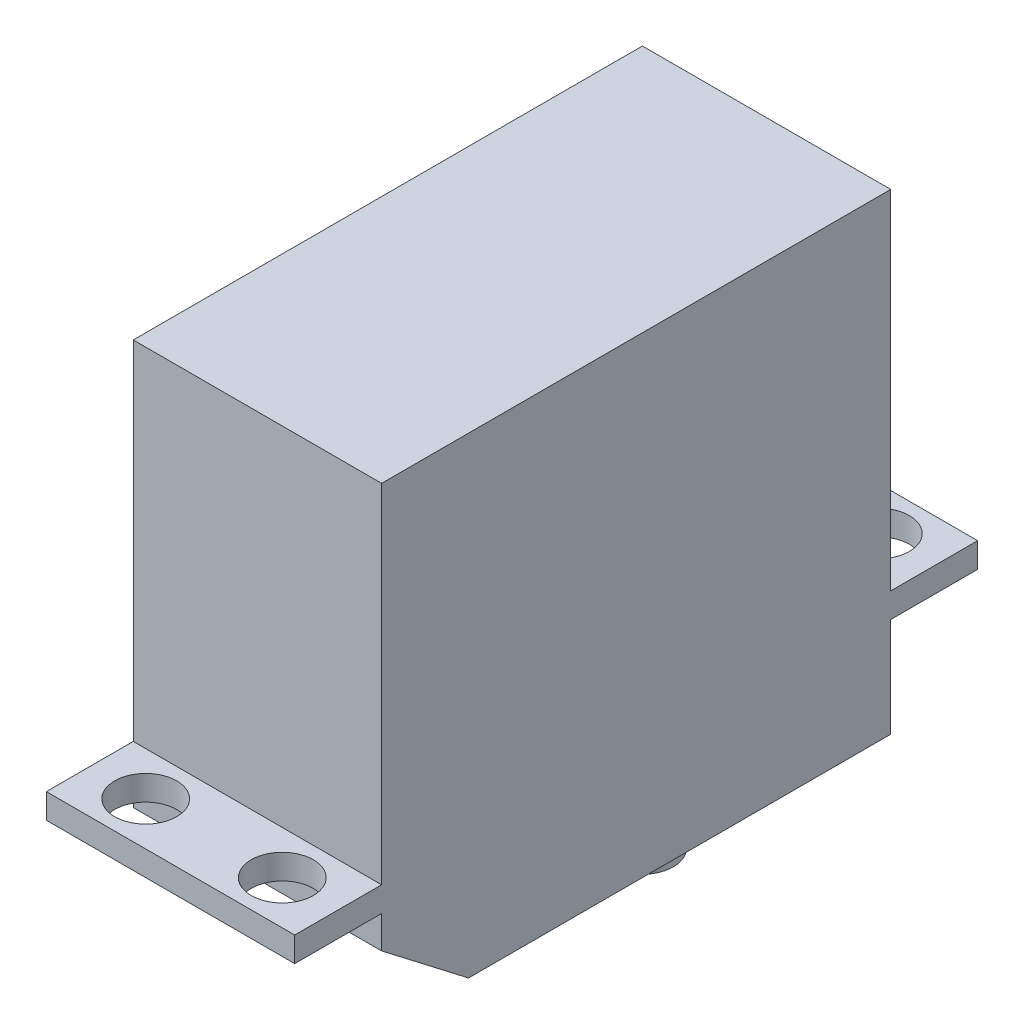
ISO-10303-21;
HEADER;
FILE_DESCRIPTION(('STEP AP214'),'2;1');
FILE_NAME('part.step','',(''),(''),'','','');
FILE_SCHEMA(('AUTOMOTIVE_DESIGN { 1 0 10303 214 1 1 1 1 }'));
ENDSEC;
DATA;
#1=APPLICATION_CONTEXT('core data for automotive mechanical design processes');
#2=APPLICATION_PROTOCOL_DEFINITION('international standard','automotive_design',2000,#1);
#3=PRODUCT_CONTEXT('',#1,'mechanical');
#4=PRODUCT('Part','Part','',(#3));
#5=PRODUCT_RELATED_PRODUCT_CATEGORY('part','',(#4));
#6=PRODUCT_DEFINITION_FORMATION('','',#4);
#7=PRODUCT_DEFINITION_CONTEXT('part definition',#1,'design');
#8=PRODUCT_DEFINITION('design','',#6,#7);
#9=PRODUCT_DEFINITION_SHAPE('','',#8);
#10=(LENGTH_UNIT() NAMED_UNIT(*) SI_UNIT(.MILLI.,.METRE.));
#11=(NAMED_UNIT(*) PLANE_ANGLE_UNIT() SI_UNIT($,.RADIAN.));
#12=(NAMED_UNIT(*) SI_UNIT($,.STERADIAN.) SOLID_ANGLE_UNIT());
#13=UNCERTAINTY_MEASURE_WITH_UNIT(LENGTH_MEASURE(1.E-05),#10,'distance_accuracy_value','');
#14=(GEOMETRIC_REPRESENTATION_CONTEXT(3) GLOBAL_UNCERTAINTY_ASSIGNED_CONTEXT((#13)) GLOBAL_UNIT_ASSIGNED_CONTEXT((#10,
#11,#12)) REPRESENTATION_CONTEXT('',''));
#15=CARTESIAN_POINT('',(0.,0.,0.));
#16=DIRECTION('',(0.,0.,1.));
#17=DIRECTION('',(1.,0.,0.));
#18=AXIS2_PLACEMENT_3D('',#15,#16,#17);
#19=CARTESIAN_POINT('',(20.,0.,-7.));
#20=DIRECTION('',(0.,1.,0.));
#21=DIRECTION('',(0.,0.,1.));
#22=AXIS2_PLACEMENT_3D('',#19,#20,#21);
#23=PLANE('',#22);
#24=DIRECTION('',(0.,0.,-1.));
#25=VECTOR('',#24,1.);
#26=CARTESIAN_POINT('',(0.,0.,-7.));
#27=LINE('',#26,#25);
#28=CARTESIAN_POINT('',(0.,0.,-7.));
#29=VERTEX_POINT('',#28);
#30=CARTESIAN_POINT('',(0.,0.,-41.));
#31=VERTEX_POINT('',#30);
#32=EDGE_CURVE('E185',#29,#31,#27,.T.);
#33=ORIENTED_EDGE('',*,*,#32,.T.);
#34=DIRECTION('',(-1.,0.,0.));
#35=VECTOR('',#34,1.);
#36=CARTESIAN_POINT('',(20.,0.,-41.));
#37=LINE('',#36,#35);
#38=CARTESIAN_POINT('',(20.,0.,-41.));
#39=VERTEX_POINT('',#38);
#40=EDGE_CURVE('E196',#39,#31,#37,.T.);
#41=ORIENTED_EDGE('',*,*,#40,.F.);
#42=DIRECTION('',(0.,0.,-1.));
#43=VECTOR('',#42,1.);
#44=CARTESIAN_POINT('',(20.,0.,-7.));
#45=LINE('',#44,#43);
#46=CARTESIAN_POINT('',(20.,0.,-7.));
#47=VERTEX_POINT('',#46);
#48=EDGE_CURVE('E261',#47,#39,#45,.T.);
#49=ORIENTED_EDGE('',*,*,#48,.F.);
#50=DIRECTION('',(-1.,0.,0.));
#51=VECTOR('',#50,1.);
#52=CARTESIAN_POINT('',(20.,0.,-7.));
#53=LINE('',#52,#51);
#54=EDGE_CURVE('E199',#47,#29,#53,.T.);
#55=ORIENTED_EDGE('',*,*,#54,.T.);
#56=EDGE_LOOP('',(#33,#41,#49,#55));
#57=FACE_BOUND('',#56,.T.);
#58=CARTESIAN_POINT('',(10.,0.,-31.));
#59=DIRECTION('',(0.,1.,0.));
#60=DIRECTION('',(0.,0.,1.));
#61=AXIS2_PLACEMENT_3D('',#58,#59,#60);
#62=CIRCLE('',#61,2.5);
#63=CARTESIAN_POINT('',(10.,0.,-28.5));
#64=VERTEX_POINT('',#63);
#65=EDGE_CURVE('E11',#64,#64,#62,.F.);
#66=ORIENTED_EDGE('',*,*,#65,.F.);
#67=EDGE_LOOP('',(#66));
#68=FACE_BOUND('',#67,.T.);
#69=ADVANCED_FACE('F37',(#57,#68),#23,.F.);
#70=CARTESIAN_POINT('',(20.,10.,-41.));
#71=DIRECTION('',(0.,0.,1.));
#72=DIRECTION('',(0.,-1.,0.));
#73=AXIS2_PLACEMENT_3D('',#70,#71,#72);
#74=PLANE('',#73);
#75=DIRECTION('',(0.,1.,0.));
#76=VECTOR('',#75,1.);
#77=CARTESIAN_POINT('',(0.,10.,-41.));
#78=LINE('',#77,#76);
#79=CARTESIAN_POINT('',(0.,10.,-41.));
#80=VERTEX_POINT('',#79);
#81=CARTESIAN_POINT('',(0.,38.,-41.));
#82=VERTEX_POINT('',#81);
#83=EDGE_CURVE('E167',#80,#82,#78,.T.);
#84=ORIENTED_EDGE('',*,*,#83,.T.);
#85=DIRECTION('',(-1.,0.,0.));
#86=VECTOR('',#85,1.);
#87=CARTESIAN_POINT('',(20.,38.,-41.));
#88=LINE('',#87,#86);
#89=CARTESIAN_POINT('',(20.,38.,-41.));
#90=VERTEX_POINT('',#89);
#91=EDGE_CURVE('E47',#90,#82,#88,.T.);
#92=ORIENTED_EDGE('',*,*,#91,.F.);
#93=DIRECTION('',(0.,1.,0.));
#94=VECTOR('',#93,1.);
#95=CARTESIAN_POINT('',(20.,10.,-41.));
#96=LINE('',#95,#94);
#97=CARTESIAN_POINT('',(20.,10.,-41.));
#98=VERTEX_POINT('',#97);
#99=EDGE_CURVE('E192',#98,#90,#96,.T.);
#100=ORIENTED_EDGE('',*,*,#99,.F.);
#101=DIRECTION('',(-1.,0.,0.));
#102=VECTOR('',#101,1.);
#103=CARTESIAN_POINT('',(20.,10.,-41.));
#104=LINE('',#103,#102);
#105=EDGE_CURVE('E163',#98,#80,#104,.T.);
#106=ORIENTED_EDGE('',*,*,#105,.T.);
#107=EDGE_LOOP('',(#84,#92,#100,#106));
#108=FACE_BOUND('',#107,.T.);
#109=ADVANCED_FACE('F39',(#108),#74,.F.);
#110=CARTESIAN_POINT('',(20.,38.,0.));
#111=DIRECTION('',(0.,-1.,0.));
#112=DIRECTION('',(0.,0.,-1.));
#113=AXIS2_PLACEMENT_3D('',#110,#111,#112);
#114=PLANE('',#113);
#115=DIRECTION('',(0.,0.,1.));
#116=VECTOR('',#115,1.);
#117=CARTESIAN_POINT('',(0.,38.,0.));
#118=LINE('',#117,#116);
#119=CARTESIAN_POINT('',(0.,38.,0.));
#120=VERTEX_POINT('',#119);
#121=EDGE_CURVE('E170',#82,#120,#118,.T.);
#122=ORIENTED_EDGE('',*,*,#121,.T.);
#123=DIRECTION('',(-1.,0.,0.));
#124=VECTOR('',#123,1.);
#125=CARTESIAN_POINT('',(20.,38.,0.));
#126=LINE('',#125,#124);
#127=CARTESIAN_POINT('',(20.,38.,0.));
#128=VERTEX_POINT('',#127);
#129=EDGE_CURVE('E217',#128,#120,#126,.T.);
#130=ORIENTED_EDGE('',*,*,#129,.F.);
#131=DIRECTION('',(0.,0.,1.));
#132=VECTOR('',#131,1.);
#133=CARTESIAN_POINT('',(20.,38.,0.));
#134=LINE('',#133,#132);
#135=EDGE_CURVE('E115',#90,#128,#134,.T.);
#136=ORIENTED_EDGE('',*,*,#135,.F.);
#137=ORIENTED_EDGE('',*,*,#91,.T.);
#138=EDGE_LOOP('',(#122,#130,#136,#137));
#139=FACE_BOUND('',#138,.T.);
#140=ADVANCED_FACE('F295',(#139),#114,.F.);
#141=CARTESIAN_POINT('',(20.,10.,0.));
#142=DIRECTION('',(0.,0.,-1.));
#143=DIRECTION('',(-1.,0.,0.));
#144=AXIS2_PLACEMENT_3D('',#141,#142,#143);
#145=PLANE('',#144);
#146=DIRECTION('',(0.,-1.,0.));
#147=VECTOR('',#146,1.);
#148=CARTESIAN_POINT('',(0.,10.,0.));
#149=LINE('',#148,#147);
#150=CARTESIAN_POINT('',(0.,10.,0.));
#151=VERTEX_POINT('',#150);
#152=EDGE_CURVE('E173',#120,#151,#149,.T.);
#153=ORIENTED_EDGE('',*,*,#152,.T.);
#154=DIRECTION('',(-1.,0.,0.));
#155=VECTOR('',#154,1.);
#156=CARTESIAN_POINT('',(20.,10.,0.));
#157=LINE('',#156,#155);
#158=CARTESIAN_POINT('',(20.,10.,0.));
#159=VERTEX_POINT('',#158);
#160=EDGE_CURVE('E214',#159,#151,#157,.T.);
#161=ORIENTED_EDGE('',*,*,#160,.F.);
#162=DIRECTION('',(0.,-1.,0.));
#163=VECTOR('',#162,1.);
#164=CARTESIAN_POINT('',(20.,10.,0.));
#165=LINE('',#164,#163);
#166=EDGE_CURVE('E249',#128,#159,#165,.T.);
#167=ORIENTED_EDGE('',*,*,#166,.F.);
#168=ORIENTED_EDGE('',*,*,#129,.T.);
#169=EDGE_LOOP('',(#153,#161,#167,#168));
#170=FACE_BOUND('',#169,.T.);
#171=ADVANCED_FACE('F318',(#170),#145,.F.);
#172=CARTESIAN_POINT('',(20.,10.,7.));
#173=DIRECTION('',(0.,-1.,0.));
#174=DIRECTION('',(0.,0.,-1.));
#175=AXIS2_PLACEMENT_3D('',#172,#173,#174);
#176=PLANE('',#175);
#177=CARTESIAN_POINT('',(15.5,10.,3.5));
#178=DIRECTION('',(0.,-1.,0.));
#179=DIRECTION('',(0.,0.,-1.));
#180=AXIS2_PLACEMENT_3D('',#177,#178,#179);
#181=CIRCLE('',#180,2.5);
#182=CARTESIAN_POINT('',(15.5,10.,1.));
#183=VERTEX_POINT('',#182);
#184=EDGE_CURVE('E227',#183,#183,#181,.T.);
#185=ORIENTED_EDGE('',*,*,#184,.T.);
#186=EDGE_LOOP('',(#185));
#187=FACE_BOUND('',#186,.T.);
#188=CARTESIAN_POINT('',(4.5,10.,3.5));
#189=DIRECTION('',(0.,-1.,0.));
#190=DIRECTION('',(0.,0.,-1.));
#191=AXIS2_PLACEMENT_3D('',#188,#189,#190);
#192=CIRCLE('',#191,2.5);
#193=CARTESIAN_POINT('',(4.5,10.,1.));
#194=VERTEX_POINT('',#193);
#195=EDGE_CURVE('E242',#194,#194,#192,.T.);
#196=ORIENTED_EDGE('',*,*,#195,.T.);
#197=EDGE_LOOP('',(#196));
#198=FACE_BOUND('',#197,.T.);
#199=DIRECTION('',(0.,0.,1.));
#200=VECTOR('',#199,1.);
#201=CARTESIAN_POINT('',(0.,10.,7.));
#202=LINE('',#201,#200);
#203=CARTESIAN_POINT('',(0.,10.,7.));
#204=VERTEX_POINT('',#203);
#205=EDGE_CURVE('E175',#151,#204,#202,.T.);
#206=ORIENTED_EDGE('',*,*,#205,.T.);
#207=DIRECTION('',(-1.,0.,0.));
#208=VECTOR('',#207,1.);
#209=CARTESIAN_POINT('',(20.,10.,7.));
#210=LINE('',#209,#208);
#211=CARTESIAN_POINT('',(20.,10.,7.));
#212=VERTEX_POINT('',#211);
#213=EDGE_CURVE('E211',#212,#204,#210,.T.);
#214=ORIENTED_EDGE('',*,*,#213,.F.);
#215=DIRECTION('',(0.,0.,1.));
#216=VECTOR('',#215,1.);
#217=CARTESIAN_POINT('',(20.,10.,7.));
#218=LINE('',#217,#216);
#219=EDGE_CURVE('E251',#159,#212,#218,.T.);
#220=ORIENTED_EDGE('',*,*,#219,.F.);
#221=ORIENTED_EDGE('',*,*,#160,.T.);
#222=EDGE_LOOP('',(#206,#214,#220,#221));
#223=FACE_BOUND('',#222,.T.);
#224=ADVANCED_FACE('F314',(#187,#198,#223),#176,.F.);
#225=CARTESIAN_POINT('',(20.,8.,7.));
#226=DIRECTION('',(0.,0.,-1.));
#227=DIRECTION('',(-1.,0.,0.));
#228=AXIS2_PLACEMENT_3D('',#225,#226,#227);
#229=PLANE('',#228);
#230=DIRECTION('',(0.,-1.,0.));
#231=VECTOR('',#230,1.);
#232=CARTESIAN_POINT('',(0.,8.,7.));
#233=LINE('',#232,#231);
#234=CARTESIAN_POINT('',(0.,8.,7.));
#235=VERTEX_POINT('',#234);
#236=EDGE_CURVE('E177',#204,#235,#233,.T.);
#237=ORIENTED_EDGE('',*,*,#236,.T.);
#238=DIRECTION('',(-1.,0.,0.));
#239=VECTOR('',#238,1.);
#240=CARTESIAN_POINT('',(20.,8.,7.));
#241=LINE('',#240,#239);
#242=CARTESIAN_POINT('',(20.,8.,7.));
#243=VERTEX_POINT('',#242);
#244=EDGE_CURVE('E208',#243,#235,#241,.T.);
#245=ORIENTED_EDGE('',*,*,#244,.F.);
#246=DIRECTION('',(0.,-1.,0.));
#247=VECTOR('',#246,1.);
#248=CARTESIAN_POINT('',(20.,8.,7.));
#249=LINE('',#248,#247);
#250=EDGE_CURVE('E253',#212,#243,#249,.T.);
#251=ORIENTED_EDGE('',*,*,#250,.F.);
#252=ORIENTED_EDGE('',*,*,#213,.T.);
#253=EDGE_LOOP('',(#237,#245,#251,#252));
#254=FACE_BOUND('',#253,.T.);
#255=ADVANCED_FACE('F310',(#254),#229,.F.);
#256=CARTESIAN_POINT('',(20.,8.,7.));
#257=DIRECTION('',(0.,1.,0.));
#258=DIRECTION('',(0.,0.,1.));
#259=AXIS2_PLACEMENT_3D('',#256,#257,#258);
#260=PLANE('',#259);
#261=CARTESIAN_POINT('',(15.5,8.,3.5));
#262=DIRECTION('',(0.,-1.,0.));
#263=DIRECTION('',(0.,0.,1.));
#264=AXIS2_PLACEMENT_3D('',#261,#262,#263);
#265=CIRCLE('',#264,2.5);
#266=CARTESIAN_POINT('',(15.5,8.,6.));
#267=VERTEX_POINT('',#266);
#268=EDGE_CURVE('E222',#267,#267,#265,.T.);
#269=ORIENTED_EDGE('',*,*,#268,.F.);
#270=EDGE_LOOP('',(#269));
#271=FACE_BOUND('',#270,.T.);
#272=CARTESIAN_POINT('',(4.5,8.,3.5));
#273=DIRECTION('',(0.,-1.,0.));
#274=DIRECTION('',(0.,0.,-1.));
#275=AXIS2_PLACEMENT_3D('',#272,#273,#274);
#276=CIRCLE('',#275,2.5);
#277=CARTESIAN_POINT('',(4.5,8.,1.));
#278=VERTEX_POINT('',#277);
#279=EDGE_CURVE('E239',#278,#278,#276,.T.);
#280=ORIENTED_EDGE('',*,*,#279,.F.);
#281=EDGE_LOOP('',(#280));
#282=FACE_BOUND('',#281,.T.);
#283=DIRECTION('',(0.,0.,-1.));
#284=VECTOR('',#283,1.);
#285=CARTESIAN_POINT('',(0.,8.,7.));
#286=LINE('',#285,#284);
#287=CARTESIAN_POINT('',(0.,8.,0.));
#288=VERTEX_POINT('',#287);
#289=EDGE_CURVE('E179',#235,#288,#286,.T.);
#290=ORIENTED_EDGE('',*,*,#289,.T.);
#291=DIRECTION('',(-1.,0.,0.));
#292=VECTOR('',#291,1.);
#293=CARTESIAN_POINT('',(20.,8.,0.));
#294=LINE('',#293,#292);
#295=CARTESIAN_POINT('',(20.,8.,0.));
#296=VERTEX_POINT('',#295);
#297=EDGE_CURVE('E205',#296,#288,#294,.T.);
#298=ORIENTED_EDGE('',*,*,#297,.F.);
#299=DIRECTION('',(0.,0.,-1.));
#300=VECTOR('',#299,1.);
#301=CARTESIAN_POINT('',(20.,8.,7.));
#302=LINE('',#301,#300);
#303=EDGE_CURVE('E255',#243,#296,#302,.T.);
#304=ORIENTED_EDGE('',*,*,#303,.F.);
#305=ORIENTED_EDGE('',*,*,#244,.T.);
#306=EDGE_LOOP('',(#290,#298,#304,#305));
#307=FACE_BOUND('',#306,.T.);
#308=ADVANCED_FACE('F306',(#271,#282,#307),#260,.F.);
#309=CARTESIAN_POINT('',(20.,5.38778905637312,0.));
#310=DIRECTION('',(0.,0.,-1.));
#311=DIRECTION('',(-1.,0.,0.));
#312=AXIS2_PLACEMENT_3D('',#309,#310,#311);
#313=PLANE('',#312);
#314=DIRECTION('',(0.,-1.,0.));
#315=VECTOR('',#314,1.);
#316=CARTESIAN_POINT('',(0.,5.38778905637312,0.));
#317=LINE('',#316,#315);
#318=CARTESIAN_POINT('',(0.,5.38778905637312,0.));
#319=VERTEX_POINT('',#318);
#320=EDGE_CURVE('E181',#288,#319,#317,.T.);
#321=ORIENTED_EDGE('',*,*,#320,.T.);
#322=DIRECTION('',(-1.,0.,0.));
#323=VECTOR('',#322,1.);
#324=CARTESIAN_POINT('',(20.,5.38778905637312,0.));
#325=LINE('',#324,#323);
#326=CARTESIAN_POINT('',(20.,5.38778905637312,0.));
#327=VERTEX_POINT('',#326);
#328=EDGE_CURVE('E202',#327,#319,#325,.T.);
#329=ORIENTED_EDGE('',*,*,#328,.F.);
#330=DIRECTION('',(0.,-1.,0.));
#331=VECTOR('',#330,1.);
#332=CARTESIAN_POINT('',(20.,5.38778905637312,0.));
#333=LINE('',#332,#331);
#334=EDGE_CURVE('E257',#296,#327,#333,.T.);
#335=ORIENTED_EDGE('',*,*,#334,.F.);
#336=ORIENTED_EDGE('',*,*,#297,.T.);
#337=EDGE_LOOP('',(#321,#329,#335,#336));
#338=FACE_BOUND('',#337,.T.);
#339=ADVANCED_FACE('F302',(#338),#313,.F.);
#340=CARTESIAN_POINT('',(20.,0.,-7.));
#341=DIRECTION('',(0.,0.792450326036196,-0.609936456333876));
#342=DIRECTION('',(0.,0.609936456333876,0.792450326036197));
#343=AXIS2_PLACEMENT_3D('',#340,#341,#342);
#344=PLANE('',#343);
#345=DIRECTION('',(0.,-0.609936456333876,-0.792450326036196));
#346=VECTOR('',#345,1.);
#347=CARTESIAN_POINT('',(0.,0.,-7.));
#348=LINE('',#347,#346);
#349=EDGE_CURVE('E183',#319,#29,#348,.T.);
#350=ORIENTED_EDGE('',*,*,#349,.T.);
#351=ORIENTED_EDGE('',*,*,#54,.F.);
#352=DIRECTION('',(0.,-0.609936456333876,-0.792450326036196));
#353=VECTOR('',#352,1.);
#354=CARTESIAN_POINT('',(20.,0.,-7.));
#355=LINE('',#354,#353);
#356=EDGE_CURVE('E259',#327,#47,#355,.T.);
#357=ORIENTED_EDGE('',*,*,#356,.F.);
#358=ORIENTED_EDGE('',*,*,#328,.T.);
#359=EDGE_LOOP('',(#350,#351,#357,#358));
#360=FACE_BOUND('',#359,.T.);
#361=ADVANCED_FACE('F299',(#360),#344,.F.);
#362=CARTESIAN_POINT('',(20.,0.,-41.));
#363=DIRECTION('',(0.,0.,1.));
#364=DIRECTION('',(1.,0.,0.));
#365=AXIS2_PLACEMENT_3D('',#362,#363,#364);
#366=PLANE('',#365);
#367=DIRECTION('',(0.,1.,0.));
#368=VECTOR('',#367,1.);
#369=CARTESIAN_POINT('',(0.,0.,-41.));
#370=LINE('',#369,#368);
#371=CARTESIAN_POINT('',(0.,8.,-41.));
#372=VERTEX_POINT('',#371);
#373=EDGE_CURVE('E187',#31,#372,#370,.T.);
#374=ORIENTED_EDGE('',*,*,#373,.T.);
#375=DIRECTION('',(-1.,0.,0.));
#376=VECTOR('',#375,1.);
#377=CARTESIAN_POINT('',(20.,8.,-41.));
#378=LINE('',#377,#376);
#379=CARTESIAN_POINT('',(20.,8.,-41.));
#380=VERTEX_POINT('',#379);
#381=EDGE_CURVE('E158',#380,#372,#378,.T.);
#382=ORIENTED_EDGE('',*,*,#381,.F.);
#383=DIRECTION('',(0.,1.,0.));
#384=VECTOR('',#383,1.);
#385=CARTESIAN_POINT('',(20.,0.,-41.));
#386=LINE('',#385,#384);
#387=EDGE_CURVE('E149',#39,#380,#386,.T.);
#388=ORIENTED_EDGE('',*,*,#387,.F.);
#389=ORIENTED_EDGE('',*,*,#40,.T.);
#390=EDGE_LOOP('',(#374,#382,#388,#389));
#391=FACE_BOUND('',#390,.T.);
#392=ADVANCED_FACE('F271',(#391),#366,.F.);
#393=CARTESIAN_POINT('',(20.,8.,-41.));
#394=DIRECTION('',(0.,1.,0.));
#395=DIRECTION('',(0.,0.,1.));
#396=AXIS2_PLACEMENT_3D('',#393,#394,#395);
#397=PLANE('',#396);
#398=CARTESIAN_POINT('',(4.50000000000001,8.,-44.5));
#399=DIRECTION('',(0.,-1.,0.));
#400=DIRECTION('',(0.,0.,1.));
#401=AXIS2_PLACEMENT_3D('',#398,#399,#400);
#402=CIRCLE('',#401,2.5);
#403=CARTESIAN_POINT('',(4.50000000000001,8.,-42.));
#404=VERTEX_POINT('',#403);
#405=EDGE_CURVE('E234',#404,#404,#402,.T.);
#406=ORIENTED_EDGE('',*,*,#405,.F.);
#407=EDGE_LOOP('',(#406));
#408=FACE_BOUND('',#407,.T.);
#409=CARTESIAN_POINT('',(15.5,8.,-44.5));
#410=DIRECTION('',(0.,-1.,0.));
#411=DIRECTION('',(0.,0.,-1.));
#412=AXIS2_PLACEMENT_3D('',#409,#410,#411);
#413=CIRCLE('',#412,2.5);
#414=CARTESIAN_POINT('',(15.5,8.,-47.));
#415=VERTEX_POINT('',#414);
#416=EDGE_CURVE('E223',#415,#415,#413,.T.);
#417=ORIENTED_EDGE('',*,*,#416,.F.);
#418=EDGE_LOOP('',(#417));
#419=FACE_BOUND('',#418,.T.);
#420=DIRECTION('',(0.,0.,-1.));
#421=VECTOR('',#420,1.);
#422=CARTESIAN_POINT('',(0.,8.,-41.));
#423=LINE('',#422,#421);
#424=CARTESIAN_POINT('',(0.,8.,-48.));
#425=VERTEX_POINT('',#424);
#426=EDGE_CURVE('E157',#372,#425,#423,.T.);
#427=ORIENTED_EDGE('',*,*,#426,.T.);
#428=DIRECTION('',(-1.,0.,0.));
#429=VECTOR('',#428,1.);
#430=CARTESIAN_POINT('',(20.,8.,-48.));
#431=LINE('',#430,#429);
#432=CARTESIAN_POINT('',(20.,8.,-48.));
#433=VERTEX_POINT('',#432);
#434=EDGE_CURVE('E154',#433,#425,#431,.T.);
#435=ORIENTED_EDGE('',*,*,#434,.F.);
#436=DIRECTION('',(0.,0.,-1.));
#437=VECTOR('',#436,1.);
#438=CARTESIAN_POINT('',(20.,8.,-41.));
#439=LINE('',#438,#437);
#440=EDGE_CURVE('E143',#380,#433,#439,.T.);
#441=ORIENTED_EDGE('',*,*,#440,.F.);
#442=ORIENTED_EDGE('',*,*,#381,.T.);
#443=EDGE_LOOP('',(#427,#435,#441,#442));
#444=FACE_BOUND('',#443,.T.);
#445=ADVANCED_FACE('F155',(#408,#419,#444),#397,.F.);
#446=CARTESIAN_POINT('',(20.,8.,-48.));
#447=DIRECTION('',(0.,0.,1.));
#448=DIRECTION('',(1.,0.,0.));
#449=AXIS2_PLACEMENT_3D('',#446,#447,#448);
#450=PLANE('',#449);
#451=DIRECTION('',(0.,1.,0.));
#452=VECTOR('',#451,1.);
#453=CARTESIAN_POINT('',(0.,8.,-48.));
#454=LINE('',#453,#452);
#455=CARTESIAN_POINT('',(0.,10.,-48.));
#456=VERTEX_POINT('',#455);
#457=EDGE_CURVE('E100',#425,#456,#454,.T.);
#458=ORIENTED_EDGE('',*,*,#457,.T.);
#459=DIRECTION('',(-1.,0.,0.));
#460=VECTOR('',#459,1.);
#461=CARTESIAN_POINT('',(20.,10.,-48.));
#462=LINE('',#461,#460);
#463=CARTESIAN_POINT('',(20.,10.,-48.));
#464=VERTEX_POINT('',#463);
#465=EDGE_CURVE('E159',#464,#456,#462,.T.);
#466=ORIENTED_EDGE('',*,*,#465,.F.);
#467=DIRECTION('',(0.,1.,0.));
#468=VECTOR('',#467,1.);
#469=CARTESIAN_POINT('',(20.,8.,-48.));
#470=LINE('',#469,#468);
#471=EDGE_CURVE('E147',#433,#464,#470,.T.);
#472=ORIENTED_EDGE('',*,*,#471,.F.);
#473=ORIENTED_EDGE('',*,*,#434,.T.);
#474=EDGE_LOOP('',(#458,#466,#472,#473));
#475=FACE_BOUND('',#474,.T.);
#476=ADVANCED_FACE('F161',(#475),#450,.F.);
#477=CARTESIAN_POINT('',(20.,10.,-41.));
#478=DIRECTION('',(0.,-1.,0.));
#479=DIRECTION('',(0.,0.,-1.));
#480=AXIS2_PLACEMENT_3D('',#477,#478,#479);
#481=PLANE('',#480);
#482=CARTESIAN_POINT('',(4.50000000000001,10.,-44.5));
#483=DIRECTION('',(0.,-1.,0.));
#484=DIRECTION('',(0.,0.,-1.));
#485=AXIS2_PLACEMENT_3D('',#482,#483,#484);
#486=CIRCLE('',#485,2.5);
#487=CARTESIAN_POINT('',(4.50000000000001,10.,-47.));
#488=VERTEX_POINT('',#487);
#489=EDGE_CURVE('E41',#488,#488,#486,.T.);
#490=ORIENTED_EDGE('',*,*,#489,.T.);
#491=EDGE_LOOP('',(#490));
#492=FACE_BOUND('',#491,.T.);
#493=CARTESIAN_POINT('',(15.5,10.,-44.5));
#494=DIRECTION('',(0.,-1.,0.));
#495=DIRECTION('',(0.,0.,-1.));
#496=AXIS2_PLACEMENT_3D('',#493,#494,#495);
#497=CIRCLE('',#496,2.5);
#498=CARTESIAN_POINT('',(15.5,10.,-47.));
#499=VERTEX_POINT('',#498);
#500=EDGE_CURVE('E220',#499,#499,#497,.T.);
#501=ORIENTED_EDGE('',*,*,#500,.T.);
#502=EDGE_LOOP('',(#501));
#503=FACE_BOUND('',#502,.T.);
#504=DIRECTION('',(0.,0.,1.));
#505=VECTOR('',#504,1.);
#506=CARTESIAN_POINT('',(0.,10.,-41.));
#507=LINE('',#506,#505);
#508=EDGE_CURVE('E106',#456,#80,#507,.T.);
#509=ORIENTED_EDGE('',*,*,#508,.T.);
#510=ORIENTED_EDGE('',*,*,#105,.F.);
#511=DIRECTION('',(0.,0.,1.));
#512=VECTOR('',#511,1.);
#513=CARTESIAN_POINT('',(20.,10.,-41.));
#514=LINE('',#513,#512);
#515=EDGE_CURVE('E56',#464,#98,#514,.T.);
#516=ORIENTED_EDGE('',*,*,#515,.F.);
#517=ORIENTED_EDGE('',*,*,#465,.T.);
#518=EDGE_LOOP('',(#509,#510,#516,#517));
#519=FACE_BOUND('',#518,.T.);
#520=ADVANCED_FACE('F279',(#492,#503,#519),#481,.F.);
#521=CARTESIAN_POINT('',(20.,0.,0.));
#522=DIRECTION('',(-1.,0.,0.));
#523=DIRECTION('',(0.,0.,1.));
#524=AXIS2_PLACEMENT_3D('',#521,#522,#523);
#525=PLANE('',#524);
#526=ORIENTED_EDGE('',*,*,#99,.T.);
#527=ORIENTED_EDGE('',*,*,#135,.T.);
#528=ORIENTED_EDGE('',*,*,#166,.T.);
#529=ORIENTED_EDGE('',*,*,#219,.T.);
#530=ORIENTED_EDGE('',*,*,#250,.T.);
#531=ORIENTED_EDGE('',*,*,#303,.T.);
#532=ORIENTED_EDGE('',*,*,#334,.T.);
#533=ORIENTED_EDGE('',*,*,#356,.T.);
#534=ORIENTED_EDGE('',*,*,#48,.T.);
#535=ORIENTED_EDGE('',*,*,#387,.T.);
#536=ORIENTED_EDGE('',*,*,#440,.T.);
#537=ORIENTED_EDGE('',*,*,#471,.T.);
#538=ORIENTED_EDGE('',*,*,#515,.T.);
#539=EDGE_LOOP('',(#526,#527,#528,#529,#530,#531,#532,#533,#534,#535,#536,#537,#538));
#540=FACE_BOUND('',#539,.T.);
#541=ADVANCED_FACE('F145',(#540),#525,.F.);
#542=CARTESIAN_POINT('',(0.,0.,0.));
#543=DIRECTION('',(-1.,0.,0.));
#544=DIRECTION('',(0.,0.,1.));
#545=AXIS2_PLACEMENT_3D('',#542,#543,#544);
#546=PLANE('',#545);
#547=ORIENTED_EDGE('',*,*,#83,.F.);
#548=ORIENTED_EDGE('',*,*,#508,.F.);
#549=ORIENTED_EDGE('',*,*,#457,.F.);
#550=ORIENTED_EDGE('',*,*,#426,.F.);
#551=ORIENTED_EDGE('',*,*,#373,.F.);
#552=ORIENTED_EDGE('',*,*,#32,.F.);
#553=ORIENTED_EDGE('',*,*,#349,.F.);
#554=ORIENTED_EDGE('',*,*,#320,.F.);
#555=ORIENTED_EDGE('',*,*,#289,.F.);
#556=ORIENTED_EDGE('',*,*,#236,.F.);
#557=ORIENTED_EDGE('',*,*,#205,.F.);
#558=ORIENTED_EDGE('',*,*,#152,.F.);
#559=ORIENTED_EDGE('',*,*,#121,.F.);
#560=EDGE_LOOP('',(#547,#548,#549,#550,#551,#552,#553,#554,#555,#556,#557,#558,#559));
#561=FACE_BOUND('',#560,.T.);
#562=ADVANCED_FACE('F274',(#561),#546,.T.);
#563=CARTESIAN_POINT('',(10.,-8.,-31.));
#564=DIRECTION('',(0.,1.,0.));
#565=DIRECTION('',(0.,0.,1.));
#566=AXIS2_PLACEMENT_3D('',#563,#564,#565);
#567=CYLINDRICAL_SURFACE('',#566,2.5);
#568=CARTESIAN_POINT('',(10.,-8.,-31.));
#569=DIRECTION('',(0.,-1.,0.));
#570=DIRECTION('',(0.,0.,-1.));
#571=AXIS2_PLACEMENT_3D('',#568,#569,#570);
#572=CIRCLE('',#571,2.5);
#573=CARTESIAN_POINT('',(10.,-8.,-33.5));
#574=VERTEX_POINT('',#573);
#575=EDGE_CURVE('E171',#574,#574,#572,.T.);
#576=ORIENTED_EDGE('',*,*,#575,.F.);
#577=EDGE_LOOP('',(#576));
#578=FACE_BOUND('',#577,.T.);
#579=ORIENTED_EDGE('',*,*,#65,.T.);
#580=EDGE_LOOP('',(#579));
#581=FACE_BOUND('',#580,.T.);
#582=ADVANCED_FACE('F399',(#578,#581),#567,.T.);
#583=CARTESIAN_POINT('',(10.,-8.,-31.));
#584=DIRECTION('',(0.,-1.,0.));
#585=DIRECTION('',(0.,0.,-1.));
#586=AXIS2_PLACEMENT_3D('',#583,#584,#585);
#587=PLANE('',#586);
#588=ORIENTED_EDGE('',*,*,#575,.T.);
#589=EDGE_LOOP('',(#588));
#590=FACE_BOUND('',#589,.T.);
#591=ADVANCED_FACE('F411',(#590),#587,.T.);
#592=CARTESIAN_POINT('',(4.5,18.,3.5));
#593=DIRECTION('',(0.,-1.,0.));
#594=DIRECTION('',(0.,0.,-1.));
#595=AXIS2_PLACEMENT_3D('',#592,#593,#594);
#596=CYLINDRICAL_SURFACE('',#595,2.5);
#597=ORIENTED_EDGE('',*,*,#279,.T.);
#598=EDGE_LOOP('',(#597));
#599=FACE_BOUND('',#598,.T.);
#600=ORIENTED_EDGE('',*,*,#195,.F.);
#601=EDGE_LOOP('',(#600));
#602=FACE_BOUND('',#601,.T.);
#603=ADVANCED_FACE('F420',(#599,#602),#596,.F.);
#604=CARTESIAN_POINT('',(15.5,18.,3.5));
#605=DIRECTION('',(0.,-1.,0.));
#606=DIRECTION('',(0.,0.,-1.));
#607=AXIS2_PLACEMENT_3D('',#604,#605,#606);
#608=CYLINDRICAL_SURFACE('',#607,2.5);
#609=ORIENTED_EDGE('',*,*,#268,.T.);
#610=EDGE_LOOP('',(#609));
#611=FACE_BOUND('',#610,.T.);
#612=ORIENTED_EDGE('',*,*,#184,.F.);
#613=EDGE_LOOP('',(#612));
#614=FACE_BOUND('',#613,.T.);
#615=ADVANCED_FACE('F431',(#611,#614),#608,.F.);
#616=CARTESIAN_POINT('',(15.5,18.,-44.5));
#617=DIRECTION('',(0.,-1.,0.));
#618=DIRECTION('',(0.,0.,-1.));
#619=AXIS2_PLACEMENT_3D('',#616,#617,#618);
#620=CYLINDRICAL_SURFACE('',#619,2.5);
#621=ORIENTED_EDGE('',*,*,#416,.T.);
#622=EDGE_LOOP('',(#621));
#623=FACE_BOUND('',#622,.T.);
#624=ORIENTED_EDGE('',*,*,#500,.F.);
#625=EDGE_LOOP('',(#624));
#626=FACE_BOUND('',#625,.T.);
#627=ADVANCED_FACE('F438',(#623,#626),#620,.F.);
#628=CARTESIAN_POINT('',(4.50000000000001,18.,-44.5));
#629=DIRECTION('',(0.,-1.,0.));
#630=DIRECTION('',(0.,0.,-1.));
#631=AXIS2_PLACEMENT_3D('',#628,#629,#630);
#632=CYLINDRICAL_SURFACE('',#631,2.5);
#633=ORIENTED_EDGE('',*,*,#405,.T.);
#634=EDGE_LOOP('',(#633));
#635=FACE_BOUND('',#634,.T.);
#636=ORIENTED_EDGE('',*,*,#489,.F.);
#637=EDGE_LOOP('',(#636));
#638=FACE_BOUND('',#637,.T.);
#639=ADVANCED_FACE('F446',(#635,#638),#632,.F.);
#640=CLOSED_SHELL('',(#69,#109,#140,#171,#224,#255,#308,#339,#361,#392,#445,#476,#520,#541,#562,
#582,#591,#603,#615,#627,#639));
#641=MANIFOLD_SOLID_BREP('B2',#640);
#642=ADVANCED_BREP_SHAPE_REPRESENTATION('',(#18,#641),#14);
#643=SHAPE_DEFINITION_REPRESENTATION(#9,#642);
ENDSEC;
END-ISO-10303-21;
